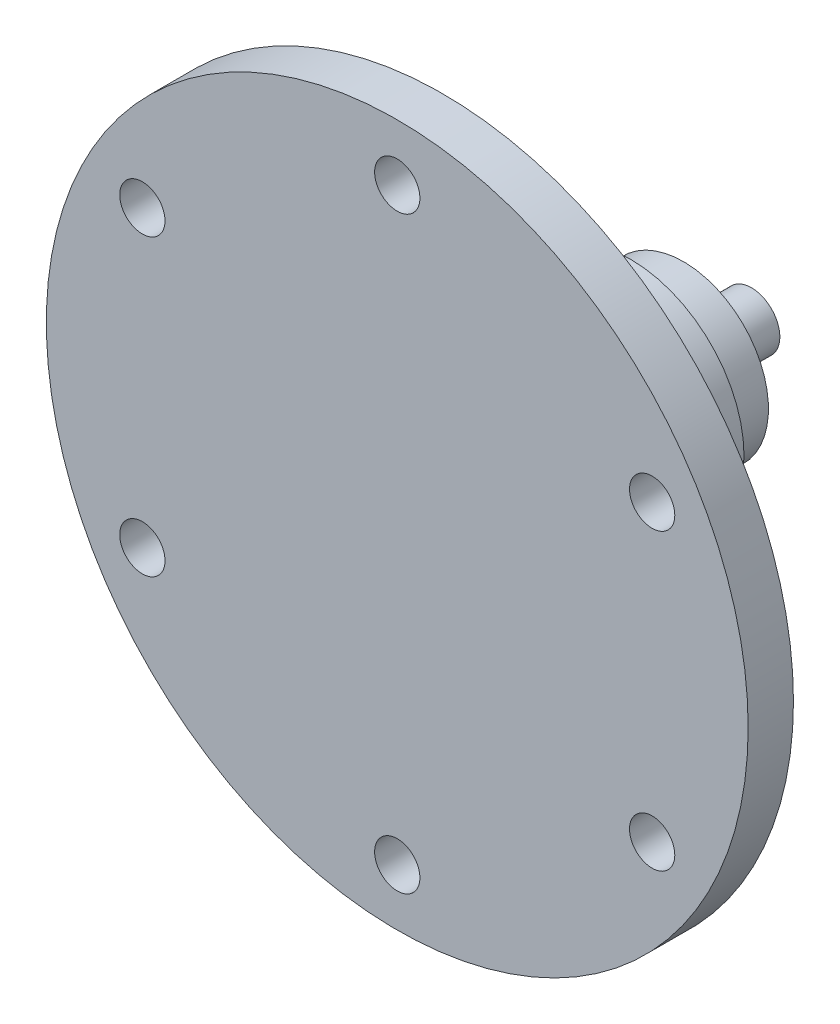
ISO-10303-21;
HEADER;
FILE_DESCRIPTION(('STEP AP214'),'2;1');
FILE_NAME('part.step','',(''),(''),'','','');
FILE_SCHEMA(('AUTOMOTIVE_DESIGN { 1 0 10303 214 1 1 1 1 }'));
ENDSEC;
DATA;
#1=APPLICATION_CONTEXT('core data for automotive mechanical design processes');
#2=APPLICATION_PROTOCOL_DEFINITION('international standard','automotive_design',2000,#1);
#3=PRODUCT_CONTEXT('',#1,'mechanical');
#4=PRODUCT('Part','Part','',(#3));
#5=PRODUCT_RELATED_PRODUCT_CATEGORY('part','',(#4));
#6=PRODUCT_DEFINITION_FORMATION('','',#4);
#7=PRODUCT_DEFINITION_CONTEXT('part definition',#1,'design');
#8=PRODUCT_DEFINITION('design','',#6,#7);
#9=PRODUCT_DEFINITION_SHAPE('','',#8);
#10=(LENGTH_UNIT() NAMED_UNIT(*) SI_UNIT(.MILLI.,.METRE.));
#11=(NAMED_UNIT(*) PLANE_ANGLE_UNIT() SI_UNIT($,.RADIAN.));
#12=(NAMED_UNIT(*) SI_UNIT($,.STERADIAN.) SOLID_ANGLE_UNIT());
#13=UNCERTAINTY_MEASURE_WITH_UNIT(LENGTH_MEASURE(1.E-05),#10,'distance_accuracy_value','');
#14=(GEOMETRIC_REPRESENTATION_CONTEXT(3) GLOBAL_UNCERTAINTY_ASSIGNED_CONTEXT((#13)) GLOBAL_UNIT_ASSIGNED_CONTEXT((#10,
#11,#12)) REPRESENTATION_CONTEXT('',''));
#15=CARTESIAN_POINT('',(0.,0.,0.));
#16=DIRECTION('',(0.,0.,1.));
#17=DIRECTION('',(1.,0.,0.));
#18=AXIS2_PLACEMENT_3D('',#15,#16,#17);
#19=CARTESIAN_POINT('',(0.,0.,4.));
#20=DIRECTION('',(0.,0.,1.));
#21=DIRECTION('',(1.,0.,0.));
#22=AXIS2_PLACEMENT_3D('',#19,#20,#21);
#23=PLANE('',#22);
#24=CARTESIAN_POINT('',(-22.5166604983955,-12.9999999999998,4.));
#25=DIRECTION('',(0.,0.,1.));
#26=DIRECTION('',(1.,0.,0.));
#27=AXIS2_PLACEMENT_3D('',#24,#25,#26);
#28=CIRCLE('',#27,2.);
#29=CARTESIAN_POINT('',(-20.5166604983955,-12.9999999999998,4.));
#30=VERTEX_POINT('',#29);
#31=EDGE_CURVE('E71',#30,#30,#28,.T.);
#32=ORIENTED_EDGE('',*,*,#31,.F.);
#33=EDGE_LOOP('',(#32));
#34=FACE_BOUND('',#33,.T.);
#35=CARTESIAN_POINT('',(22.5166604983953,-13.0000000000001,4.));
#36=DIRECTION('',(0.,0.,1.));
#37=DIRECTION('',(1.,0.,0.));
#38=AXIS2_PLACEMENT_3D('',#35,#36,#37);
#39=CIRCLE('',#38,2.);
#40=CARTESIAN_POINT('',(24.5166604983954,-13.0000000000001,4.));
#41=VERTEX_POINT('',#40);
#42=EDGE_CURVE('E83',#41,#41,#39,.T.);
#43=ORIENTED_EDGE('',*,*,#42,.F.);
#44=EDGE_LOOP('',(#43));
#45=FACE_BOUND('',#44,.T.);
#46=CARTESIAN_POINT('',(0.,26.,4.));
#47=DIRECTION('',(0.,0.,1.));
#48=DIRECTION('',(1.,0.,0.));
#49=AXIS2_PLACEMENT_3D('',#46,#47,#48);
#50=CIRCLE('',#49,2.);
#51=CARTESIAN_POINT('',(2.,26.,4.));
#52=VERTEX_POINT('',#51);
#53=EDGE_CURVE('E95',#52,#52,#50,.T.);
#54=ORIENTED_EDGE('',*,*,#53,.F.);
#55=EDGE_LOOP('',(#54));
#56=FACE_BOUND('',#55,.T.);
#57=CARTESIAN_POINT('',(0.,0.,4.));
#58=DIRECTION('',(0.,0.,1.));
#59=DIRECTION('',(1.,0.,0.));
#60=AXIS2_PLACEMENT_3D('',#57,#58,#59);
#61=CIRCLE('',#60,31.);
#62=CARTESIAN_POINT('',(31.,0.,4.));
#63=VERTEX_POINT('',#62);
#64=EDGE_CURVE('E101',#63,#63,#61,.T.);
#65=ORIENTED_EDGE('',*,*,#64,.T.);
#66=EDGE_LOOP('',(#65));
#67=FACE_BOUND('',#66,.T.);
#68=CARTESIAN_POINT('',(22.5166604983954,12.9999999999999,4.));
#69=DIRECTION('',(0.,0.,1.));
#70=DIRECTION('',(1.,0.,0.));
#71=AXIS2_PLACEMENT_3D('',#68,#69,#70);
#72=CIRCLE('',#71,2.);
#73=CARTESIAN_POINT('',(24.5166604983954,12.9999999999999,4.));
#74=VERTEX_POINT('',#73);
#75=EDGE_CURVE('E89',#74,#74,#72,.T.);
#76=ORIENTED_EDGE('',*,*,#75,.F.);
#77=EDGE_LOOP('',(#76));
#78=FACE_BOUND('',#77,.T.);
#79=CARTESIAN_POINT('',(-1.81557029619843E-13,-26.,4.));
#80=DIRECTION('',(0.,0.,1.));
#81=DIRECTION('',(1.,0.,0.));
#82=AXIS2_PLACEMENT_3D('',#79,#80,#81);
#83=CIRCLE('',#82,2.);
#84=CARTESIAN_POINT('',(1.99999999999982,-26.,4.));
#85=VERTEX_POINT('',#84);
#86=EDGE_CURVE('E77',#85,#85,#83,.T.);
#87=ORIENTED_EDGE('',*,*,#86,.F.);
#88=EDGE_LOOP('',(#87));
#89=FACE_BOUND('',#88,.T.);
#90=CARTESIAN_POINT('',(-22.5166604983953,13.0000000000003,4.));
#91=DIRECTION('',(0.,0.,1.));
#92=DIRECTION('',(1.,0.,0.));
#93=AXIS2_PLACEMENT_3D('',#90,#91,#92);
#94=CIRCLE('',#93,2.);
#95=CARTESIAN_POINT('',(-20.5166604983953,13.0000000000003,4.));
#96=VERTEX_POINT('',#95);
#97=EDGE_CURVE('E65',#96,#96,#94,.T.);
#98=ORIENTED_EDGE('',*,*,#97,.F.);
#99=EDGE_LOOP('',(#98));
#100=FACE_BOUND('',#99,.T.);
#101=ADVANCED_FACE('F35',(#34,#45,#56,#67,#78,#89,#100),#23,.T.);
#102=CARTESIAN_POINT('',(0.,0.,0.));
#103=DIRECTION('',(0.,0.,1.));
#104=DIRECTION('',(1.,0.,0.));
#105=AXIS2_PLACEMENT_3D('',#102,#103,#104);
#106=PLANE('',#105);
#107=CARTESIAN_POINT('',(0.,0.,0.));
#108=DIRECTION('',(0.,0.,1.));
#109=DIRECTION('',(1.,0.,0.));
#110=AXIS2_PLACEMENT_3D('',#107,#108,#109);
#111=CIRCLE('',#110,22.5);
#112=CARTESIAN_POINT('',(22.5,0.,0.));
#113=VERTEX_POINT('',#112);
#114=EDGE_CURVE('E39',#113,#113,#111,.F.);
#115=ORIENTED_EDGE('',*,*,#114,.F.);
#116=EDGE_LOOP('',(#115));
#117=FACE_BOUND('',#116,.T.);
#118=CARTESIAN_POINT('',(0.,0.,0.));
#119=DIRECTION('',(0.,0.,1.));
#120=DIRECTION('',(1.,0.,0.));
#121=AXIS2_PLACEMENT_3D('',#118,#119,#120);
#122=CIRCLE('',#121,31.);
#123=CARTESIAN_POINT('',(31.,0.,0.));
#124=VERTEX_POINT('',#123);
#125=EDGE_CURVE('E98',#124,#124,#122,.T.);
#126=ORIENTED_EDGE('',*,*,#125,.F.);
#127=EDGE_LOOP('',(#126));
#128=FACE_BOUND('',#127,.T.);
#129=CARTESIAN_POINT('',(0.,26.,0.));
#130=DIRECTION('',(0.,0.,1.));
#131=DIRECTION('',(1.,0.,0.));
#132=AXIS2_PLACEMENT_3D('',#129,#130,#131);
#133=CIRCLE('',#132,2.);
#134=CARTESIAN_POINT('',(2.,26.,0.));
#135=VERTEX_POINT('',#134);
#136=EDGE_CURVE('E92',#135,#135,#133,.T.);
#137=ORIENTED_EDGE('',*,*,#136,.T.);
#138=EDGE_LOOP('',(#137));
#139=FACE_BOUND('',#138,.T.);
#140=CARTESIAN_POINT('',(22.5166604983954,12.9999999999999,0.));
#141=DIRECTION('',(0.,0.,1.));
#142=DIRECTION('',(1.,0.,0.));
#143=AXIS2_PLACEMENT_3D('',#140,#141,#142);
#144=CIRCLE('',#143,2.);
#145=CARTESIAN_POINT('',(24.5166604983954,12.9999999999999,0.));
#146=VERTEX_POINT('',#145);
#147=EDGE_CURVE('E86',#146,#146,#144,.T.);
#148=ORIENTED_EDGE('',*,*,#147,.T.);
#149=EDGE_LOOP('',(#148));
#150=FACE_BOUND('',#149,.T.);
#151=CARTESIAN_POINT('',(22.5166604983953,-13.0000000000001,0.));
#152=DIRECTION('',(0.,0.,1.));
#153=DIRECTION('',(1.,0.,0.));
#154=AXIS2_PLACEMENT_3D('',#151,#152,#153);
#155=CIRCLE('',#154,2.);
#156=CARTESIAN_POINT('',(24.5166604983954,-13.0000000000001,0.));
#157=VERTEX_POINT('',#156);
#158=EDGE_CURVE('E80',#157,#157,#155,.T.);
#159=ORIENTED_EDGE('',*,*,#158,.T.);
#160=EDGE_LOOP('',(#159));
#161=FACE_BOUND('',#160,.T.);
#162=CARTESIAN_POINT('',(-1.81557029619843E-13,-26.,0.));
#163=DIRECTION('',(0.,0.,1.));
#164=DIRECTION('',(1.,0.,0.));
#165=AXIS2_PLACEMENT_3D('',#162,#163,#164);
#166=CIRCLE('',#165,2.);
#167=CARTESIAN_POINT('',(1.99999999999982,-26.,0.));
#168=VERTEX_POINT('',#167);
#169=EDGE_CURVE('E74',#168,#168,#166,.T.);
#170=ORIENTED_EDGE('',*,*,#169,.T.);
#171=EDGE_LOOP('',(#170));
#172=FACE_BOUND('',#171,.T.);
#173=CARTESIAN_POINT('',(-22.5166604983955,-12.9999999999998,0.));
#174=DIRECTION('',(0.,0.,1.));
#175=DIRECTION('',(1.,0.,0.));
#176=AXIS2_PLACEMENT_3D('',#173,#174,#175);
#177=CIRCLE('',#176,2.);
#178=CARTESIAN_POINT('',(-20.5166604983955,-12.9999999999998,0.));
#179=VERTEX_POINT('',#178);
#180=EDGE_CURVE('E68',#179,#179,#177,.T.);
#181=ORIENTED_EDGE('',*,*,#180,.T.);
#182=EDGE_LOOP('',(#181));
#183=FACE_BOUND('',#182,.T.);
#184=CARTESIAN_POINT('',(-22.5166604983953,13.0000000000003,0.));
#185=DIRECTION('',(0.,0.,1.));
#186=DIRECTION('',(1.,0.,0.));
#187=AXIS2_PLACEMENT_3D('',#184,#185,#186);
#188=CIRCLE('',#187,2.);
#189=CARTESIAN_POINT('',(-20.5166604983953,13.0000000000003,0.));
#190=VERTEX_POINT('',#189);
#191=EDGE_CURVE('E64',#190,#190,#188,.T.);
#192=ORIENTED_EDGE('',*,*,#191,.T.);
#193=EDGE_LOOP('',(#192));
#194=FACE_BOUND('',#193,.T.);
#195=ADVANCED_FACE('F107',(#117,#128,#139,#150,#161,#172,#183,#194),#106,.F.);
#196=CARTESIAN_POINT('',(0.,0.,4.));
#197=DIRECTION('',(0.,0.,-1.));
#198=DIRECTION('',(-1.,0.,0.));
#199=AXIS2_PLACEMENT_3D('',#196,#197,#198);
#200=CYLINDRICAL_SURFACE('',#199,31.);
#201=ORIENTED_EDGE('',*,*,#64,.F.);
#202=EDGE_LOOP('',(#201));
#203=FACE_BOUND('',#202,.T.);
#204=ORIENTED_EDGE('',*,*,#125,.T.);
#205=EDGE_LOOP('',(#204));
#206=FACE_BOUND('',#205,.T.);
#207=ADVANCED_FACE('F37',(#203,#206),#200,.T.);
#208=CARTESIAN_POINT('',(0.,26.,4.));
#209=DIRECTION('',(0.,0.,-1.));
#210=DIRECTION('',(-1.,0.,0.));
#211=AXIS2_PLACEMENT_3D('',#208,#209,#210);
#212=CYLINDRICAL_SURFACE('',#211,2.);
#213=ORIENTED_EDGE('',*,*,#53,.T.);
#214=EDGE_LOOP('',(#213));
#215=FACE_BOUND('',#214,.T.);
#216=ORIENTED_EDGE('',*,*,#136,.F.);
#217=EDGE_LOOP('',(#216));
#218=FACE_BOUND('',#217,.T.);
#219=ADVANCED_FACE('F147',(#215,#218),#212,.F.);
#220=CARTESIAN_POINT('',(22.5166604983954,12.9999999999999,4.));
#221=DIRECTION('',(0.,0.,-1.));
#222=DIRECTION('',(-1.,0.,0.));
#223=AXIS2_PLACEMENT_3D('',#220,#221,#222);
#224=CYLINDRICAL_SURFACE('',#223,2.);
#225=ORIENTED_EDGE('',*,*,#75,.T.);
#226=EDGE_LOOP('',(#225));
#227=FACE_BOUND('',#226,.T.);
#228=ORIENTED_EDGE('',*,*,#147,.F.);
#229=EDGE_LOOP('',(#228));
#230=FACE_BOUND('',#229,.T.);
#231=ADVANCED_FACE('F150',(#227,#230),#224,.F.);
#232=CARTESIAN_POINT('',(22.5166604983953,-13.0000000000001,4.));
#233=DIRECTION('',(0.,0.,-1.));
#234=DIRECTION('',(-1.,0.,0.));
#235=AXIS2_PLACEMENT_3D('',#232,#233,#234);
#236=CYLINDRICAL_SURFACE('',#235,2.);
#237=ORIENTED_EDGE('',*,*,#42,.T.);
#238=EDGE_LOOP('',(#237));
#239=FACE_BOUND('',#238,.T.);
#240=ORIENTED_EDGE('',*,*,#158,.F.);
#241=EDGE_LOOP('',(#240));
#242=FACE_BOUND('',#241,.T.);
#243=ADVANCED_FACE('F154',(#239,#242),#236,.F.);
#244=CARTESIAN_POINT('',(-1.81557029619843E-13,-26.,4.));
#245=DIRECTION('',(0.,0.,-1.));
#246=DIRECTION('',(-1.,0.,0.));
#247=AXIS2_PLACEMENT_3D('',#244,#245,#246);
#248=CYLINDRICAL_SURFACE('',#247,2.);
#249=ORIENTED_EDGE('',*,*,#86,.T.);
#250=EDGE_LOOP('',(#249));
#251=FACE_BOUND('',#250,.T.);
#252=ORIENTED_EDGE('',*,*,#169,.F.);
#253=EDGE_LOOP('',(#252));
#254=FACE_BOUND('',#253,.T.);
#255=ADVANCED_FACE('F136',(#251,#254),#248,.F.);
#256=CARTESIAN_POINT('',(-22.5166604983955,-12.9999999999998,4.));
#257=DIRECTION('',(0.,0.,-1.));
#258=DIRECTION('',(-1.,0.,0.));
#259=AXIS2_PLACEMENT_3D('',#256,#257,#258);
#260=CYLINDRICAL_SURFACE('',#259,2.);
#261=ORIENTED_EDGE('',*,*,#31,.T.);
#262=EDGE_LOOP('',(#261));
#263=FACE_BOUND('',#262,.T.);
#264=ORIENTED_EDGE('',*,*,#180,.F.);
#265=EDGE_LOOP('',(#264));
#266=FACE_BOUND('',#265,.T.);
#267=ADVANCED_FACE('F126',(#263,#266),#260,.F.);
#268=CARTESIAN_POINT('',(-22.5166604983953,13.0000000000003,4.));
#269=DIRECTION('',(0.,0.,-1.));
#270=DIRECTION('',(-1.,0.,0.));
#271=AXIS2_PLACEMENT_3D('',#268,#269,#270);
#272=CYLINDRICAL_SURFACE('',#271,2.);
#273=ORIENTED_EDGE('',*,*,#97,.T.);
#274=EDGE_LOOP('',(#273));
#275=FACE_BOUND('',#274,.T.);
#276=ORIENTED_EDGE('',*,*,#191,.F.);
#277=EDGE_LOOP('',(#276));
#278=FACE_BOUND('',#277,.T.);
#279=ADVANCED_FACE('F123',(#275,#278),#272,.F.);
#280=CARTESIAN_POINT('',(0.,0.,-4.63));
#281=DIRECTION('',(0.,0.,1.));
#282=DIRECTION('',(1.,0.,0.));
#283=AXIS2_PLACEMENT_3D('',#280,#281,#282);
#284=CYLINDRICAL_SURFACE('',#283,22.5);
#285=CARTESIAN_POINT('',(0.,0.,-4.63));
#286=DIRECTION('',(0.,0.,-1.));
#287=DIRECTION('',(-1.,0.,0.));
#288=AXIS2_PLACEMENT_3D('',#285,#286,#287);
#289=CIRCLE('',#288,22.5);
#290=CARTESIAN_POINT('',(-22.5,0.,-4.63));
#291=VERTEX_POINT('',#290);
#292=EDGE_CURVE('E59',#291,#291,#289,.T.);
#293=ORIENTED_EDGE('',*,*,#292,.F.);
#294=EDGE_LOOP('',(#293));
#295=FACE_BOUND('',#294,.T.);
#296=ORIENTED_EDGE('',*,*,#114,.T.);
#297=EDGE_LOOP('',(#296));
#298=FACE_BOUND('',#297,.T.);
#299=ADVANCED_FACE('F125',(#295,#298),#284,.T.);
#300=CARTESIAN_POINT('',(0.,0.,-4.63));
#301=DIRECTION('',(0.,0.,-1.));
#302=DIRECTION('',(-1.,0.,0.));
#303=AXIS2_PLACEMENT_3D('',#300,#301,#302);
#304=PLANE('',#303);
#305=CARTESIAN_POINT('',(0.,0.,-4.63));
#306=DIRECTION('',(0.,0.,-1.));
#307=DIRECTION('',(-1.,0.,0.));
#308=AXIS2_PLACEMENT_3D('',#305,#306,#307);
#309=CIRCLE('',#308,10.);
#310=CARTESIAN_POINT('',(-10.,0.,-4.63));
#311=VERTEX_POINT('',#310);
#312=EDGE_CURVE('E48',#311,#311,#309,.T.);
#313=ORIENTED_EDGE('',*,*,#312,.F.);
#314=EDGE_LOOP('',(#313));
#315=FACE_BOUND('',#314,.T.);
#316=ORIENTED_EDGE('',*,*,#292,.T.);
#317=EDGE_LOOP('',(#316));
#318=FACE_BOUND('',#317,.T.);
#319=ADVANCED_FACE('F133',(#315,#318),#304,.T.);
#320=CARTESIAN_POINT('',(0.,0.,-16.63));
#321=DIRECTION('',(0.,0.,1.));
#322=DIRECTION('',(1.,0.,0.));
#323=AXIS2_PLACEMENT_3D('',#320,#321,#322);
#324=CYLINDRICAL_SURFACE('',#323,10.);
#325=CARTESIAN_POINT('',(0.,0.,-16.63));
#326=DIRECTION('',(0.,0.,-1.));
#327=DIRECTION('',(-1.,0.,0.));
#328=AXIS2_PLACEMENT_3D('',#325,#326,#327);
#329=CIRCLE('',#328,10.);
#330=CARTESIAN_POINT('',(-10.,0.,-16.63));
#331=VERTEX_POINT('',#330);
#332=EDGE_CURVE('E55',#331,#331,#329,.T.);
#333=ORIENTED_EDGE('',*,*,#332,.F.);
#334=EDGE_LOOP('',(#333));
#335=FACE_BOUND('',#334,.T.);
#336=ORIENTED_EDGE('',*,*,#312,.T.);
#337=EDGE_LOOP('',(#336));
#338=FACE_BOUND('',#337,.T.);
#339=ADVANCED_FACE('F206',(#335,#338),#324,.T.);
#340=CARTESIAN_POINT('',(0.,0.,-16.63));
#341=DIRECTION('',(0.,0.,-1.));
#342=DIRECTION('',(-1.,0.,0.));
#343=AXIS2_PLACEMENT_3D('',#340,#341,#342);
#344=PLANE('',#343);
#345=CARTESIAN_POINT('',(0.,0.,-16.63));
#346=DIRECTION('',(0.,0.,-1.));
#347=DIRECTION('',(-1.,0.,0.));
#348=AXIS2_PLACEMENT_3D('',#345,#346,#347);
#349=CIRCLE('',#348,7.5);
#350=CARTESIAN_POINT('',(-7.5,0.,-16.63));
#351=VERTEX_POINT('',#350);
#352=EDGE_CURVE('E43',#351,#351,#349,.T.);
#353=ORIENTED_EDGE('',*,*,#352,.F.);
#354=EDGE_LOOP('',(#353));
#355=FACE_BOUND('',#354,.T.);
#356=ORIENTED_EDGE('',*,*,#332,.T.);
#357=EDGE_LOOP('',(#356));
#358=FACE_BOUND('',#357,.T.);
#359=ADVANCED_FACE('F217',(#355,#358),#344,.T.);
#360=CARTESIAN_POINT('',(0.,0.,-21.29));
#361=DIRECTION('',(0.,0.,1.));
#362=DIRECTION('',(1.,0.,0.));
#363=AXIS2_PLACEMENT_3D('',#360,#361,#362);
#364=CYLINDRICAL_SURFACE('',#363,7.5);
#365=CARTESIAN_POINT('',(0.,0.,-21.29));
#366=DIRECTION('',(0.,0.,-1.));
#367=DIRECTION('',(-1.,0.,0.));
#368=AXIS2_PLACEMENT_3D('',#365,#366,#367);
#369=CIRCLE('',#368,7.5);
#370=CARTESIAN_POINT('',(-7.5,0.,-21.29));
#371=VERTEX_POINT('',#370);
#372=EDGE_CURVE('E53',#371,#371,#369,.T.);
#373=ORIENTED_EDGE('',*,*,#372,.F.);
#374=EDGE_LOOP('',(#373));
#375=FACE_BOUND('',#374,.T.);
#376=ORIENTED_EDGE('',*,*,#352,.T.);
#377=EDGE_LOOP('',(#376));
#378=FACE_BOUND('',#377,.T.);
#379=ADVANCED_FACE('F228',(#375,#378),#364,.T.);
#380=CARTESIAN_POINT('',(0.,0.,-21.29));
#381=DIRECTION('',(0.,0.,-1.));
#382=DIRECTION('',(-1.,0.,0.));
#383=AXIS2_PLACEMENT_3D('',#380,#381,#382);
#384=PLANE('',#383);
#385=CARTESIAN_POINT('',(0.,0.,-21.29));
#386=DIRECTION('',(0.,0.,-1.));
#387=DIRECTION('',(-1.,0.,0.));
#388=AXIS2_PLACEMENT_3D('',#385,#386,#387);
#389=CIRCLE('',#388,2.505);
#390=CARTESIAN_POINT('',(-2.505,0.,-21.29));
#391=VERTEX_POINT('',#390);
#392=EDGE_CURVE('E10',#391,#391,#389,.T.);
#393=ORIENTED_EDGE('',*,*,#392,.F.);
#394=EDGE_LOOP('',(#393));
#395=FACE_BOUND('',#394,.T.);
#396=ORIENTED_EDGE('',*,*,#372,.T.);
#397=EDGE_LOOP('',(#396));
#398=FACE_BOUND('',#397,.T.);
#399=ADVANCED_FACE('F236',(#395,#398),#384,.T.);
#400=CARTESIAN_POINT('',(0.,0.,-27.29));
#401=DIRECTION('',(0.,0.,1.));
#402=DIRECTION('',(1.,0.,0.));
#403=AXIS2_PLACEMENT_3D('',#400,#401,#402);
#404=CYLINDRICAL_SURFACE('',#403,2.505);
#405=CARTESIAN_POINT('',(0.,0.,-27.29));
#406=DIRECTION('',(0.,0.,-1.));
#407=DIRECTION('',(-1.,0.,0.));
#408=AXIS2_PLACEMENT_3D('',#405,#406,#407);
#409=CIRCLE('',#408,2.505);
#410=CARTESIAN_POINT('',(-2.505,0.,-27.29));
#411=VERTEX_POINT('',#410);
#412=EDGE_CURVE('E52',#411,#411,#409,.T.);
#413=ORIENTED_EDGE('',*,*,#412,.F.);
#414=EDGE_LOOP('',(#413));
#415=FACE_BOUND('',#414,.T.);
#416=ORIENTED_EDGE('',*,*,#392,.T.);
#417=EDGE_LOOP('',(#416));
#418=FACE_BOUND('',#417,.T.);
#419=ADVANCED_FACE('F247',(#415,#418),#404,.T.);
#420=CARTESIAN_POINT('',(0.,0.,-27.29));
#421=DIRECTION('',(0.,0.,-1.));
#422=DIRECTION('',(-1.,0.,0.));
#423=AXIS2_PLACEMENT_3D('',#420,#421,#422);
#424=PLANE('',#423);
#425=ORIENTED_EDGE('',*,*,#412,.T.);
#426=EDGE_LOOP('',(#425));
#427=FACE_BOUND('',#426,.T.);
#428=ADVANCED_FACE('F258',(#427),#424,.T.);
#429=CLOSED_SHELL('',(#101,#195,#207,#219,#231,#243,#255,#267,#279,#299,#319,#339,#359,#379,
#399,#419,#428));
#430=MANIFOLD_SOLID_BREP('B2',#429);
#431=ADVANCED_BREP_SHAPE_REPRESENTATION('',(#18,#430),#14);
#432=SHAPE_DEFINITION_REPRESENTATION(#9,#431);
ENDSEC;
END-ISO-10303-21;
